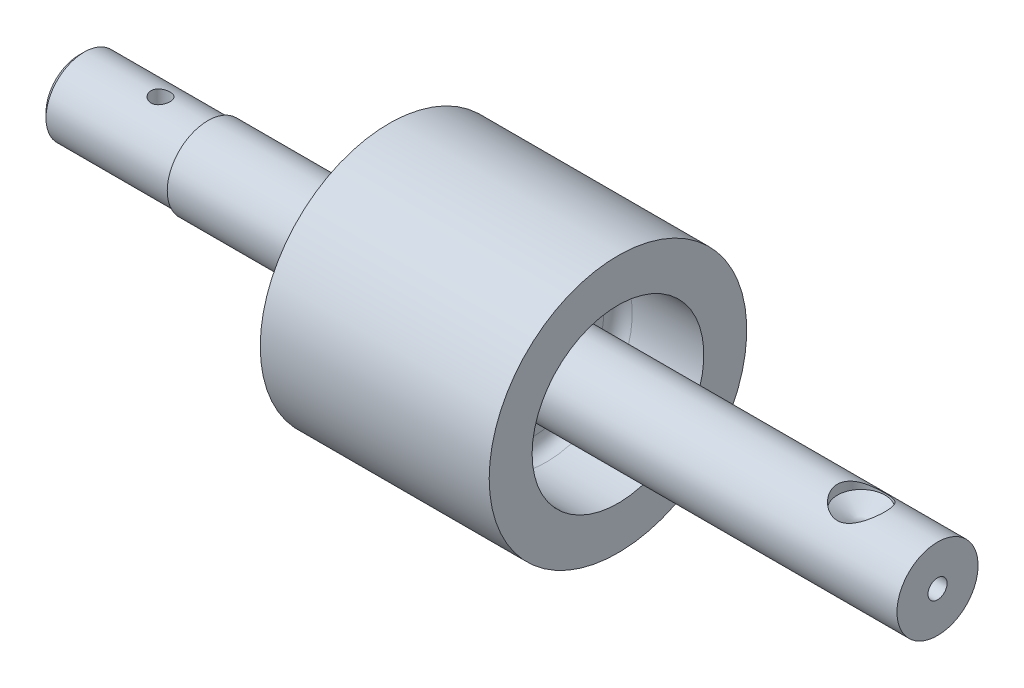
ISO-10303-21;
HEADER;
FILE_DESCRIPTION(('STEP AP214'),'2;1');
FILE_NAME('part.step','',(''),(''),'','','');
FILE_SCHEMA(('AUTOMOTIVE_DESIGN { 1 0 10303 214 1 1 1 1 }'));
ENDSEC;
DATA;
#1=APPLICATION_CONTEXT('core data for automotive mechanical design processes');
#2=APPLICATION_PROTOCOL_DEFINITION('international standard','automotive_design',2000,#1);
#3=PRODUCT_CONTEXT('',#1,'mechanical');
#4=PRODUCT('Part','Part','',(#3));
#5=PRODUCT_RELATED_PRODUCT_CATEGORY('part','',(#4));
#6=PRODUCT_DEFINITION_FORMATION('','',#4);
#7=PRODUCT_DEFINITION_CONTEXT('part definition',#1,'design');
#8=PRODUCT_DEFINITION('design','',#6,#7);
#9=PRODUCT_DEFINITION_SHAPE('','',#8);
#10=(LENGTH_UNIT() NAMED_UNIT(*) SI_UNIT(.MILLI.,.METRE.));
#11=(NAMED_UNIT(*) PLANE_ANGLE_UNIT() SI_UNIT($,.RADIAN.));
#12=(NAMED_UNIT(*) SI_UNIT($,.STERADIAN.) SOLID_ANGLE_UNIT());
#13=UNCERTAINTY_MEASURE_WITH_UNIT(LENGTH_MEASURE(1.E-05),#10,'distance_accuracy_value','');
#14=(GEOMETRIC_REPRESENTATION_CONTEXT(3) GLOBAL_UNCERTAINTY_ASSIGNED_CONTEXT((#13)) GLOBAL_UNIT_ASSIGNED_CONTEXT((#10,
#11,#12)) REPRESENTATION_CONTEXT('',''));
#15=CARTESIAN_POINT('',(0.,0.,0.));
#16=DIRECTION('',(0.,0.,1.));
#17=DIRECTION('',(1.,0.,0.));
#18=AXIS2_PLACEMENT_3D('',#15,#16,#17);
#19=CARTESIAN_POINT('',(0.,0.,0.));
#20=DIRECTION('',(-1.,0.,0.));
#21=DIRECTION('',(0.,0.,1.));
#22=AXIS2_PLACEMENT_3D('',#19,#20,#21);
#23=CYLINDRICAL_SURFACE('',#22,8.);
#24=CARTESIAN_POINT('',(17.1,7.74596669241484,1.99999999999999));
#25=CARTESIAN_POINT('',(16.9895593992587,7.74596880070288,1.99999686287445));
#26=CARTESIAN_POINT('',(16.8790840810572,7.74835444811678,1.99082099639812));
#27=CARTESIAN_POINT('',(16.6613059374612,7.75761489594051,1.95441850037103));
#28=CARTESIAN_POINT('',(16.5540049964255,7.76449230897304,1.92718136539368));
#29=CARTESIAN_POINT('',(16.3457571694503,7.7819097967692,1.85559295970563));
#30=CARTESIAN_POINT('',(16.2448022756914,7.79244514152366,1.81126378228359));
#31=CARTESIAN_POINT('',(16.0517513179681,7.81598553623007,1.7068169130091));
#32=CARTESIAN_POINT('',(15.9596556303358,7.82899069102791,1.64669855084854));
#33=CARTESIAN_POINT('',(15.7849106837902,7.856325730845,1.5109667418495));
#34=CARTESIAN_POINT('',(15.70248511972,7.87067678098427,1.43506951016324));
#35=CARTESIAN_POINT('',(15.5513908845117,7.89890300412235,1.27054565128053));
#36=CARTESIAN_POINT('',(15.4827234995026,7.91277813253111,1.18191783534424));
#37=CARTESIAN_POINT('',(15.360179625895,7.93872332416466,0.992916160863162));
#38=CARTESIAN_POINT('',(15.3065228894708,7.95076549920474,0.892395660956095));
#39=CARTESIAN_POINT('',(15.2169522846775,7.97144649540787,0.683410547434209));
#40=CARTESIAN_POINT('',(15.1810357984676,7.98008581867475,0.574947108633551));
#41=CARTESIAN_POINT('',(15.1286817323371,7.99283807078544,0.355487007003328));
#42=CARTESIAN_POINT('',(15.1118642845387,7.99703915075451,0.244586175639179));
#43=CARTESIAN_POINT('',(15.0969932965796,8.00074875285838,0.0214630554102149));
#44=CARTESIAN_POINT('',(15.0989369822323,8.00025796877363,-0.0907590356304551));
#45=CARTESIAN_POINT('',(15.1212598802001,7.99470475962828,-0.310704494344774));
#46=CARTESIAN_POINT('',(15.1412290600431,7.98974401872699,-0.418472431202134));
#47=CARTESIAN_POINT('',(15.1983770160388,7.97592669219883,-0.629076494827371));
#48=CARTESIAN_POINT('',(15.2355567083019,7.96706989918753,-0.731912358740874));
#49=CARTESIAN_POINT('',(15.3264020565497,7.94630007760717,-0.930813407003611));
#50=CARTESIAN_POINT('',(15.3802136357294,7.93436015756043,-1.02680901953301));
#51=CARTESIAN_POINT('',(15.502684543293,7.90871923047719,-1.20855124468097));
#52=CARTESIAN_POINT('',(15.5713464548485,7.89501791721992,-1.29429607017101));
#53=CARTESIAN_POINT('',(15.7237669935859,7.86690971015616,-1.45554807016991));
#54=CARTESIAN_POINT('',(15.8078839138782,7.85249375620734,-1.53071535815039));
#55=CARTESIAN_POINT('',(15.9876799788322,7.82492034813365,-1.66595275192603));
#56=CARTESIAN_POINT('',(16.0833596635928,7.81176295284777,-1.72602215209203));
#57=CARTESIAN_POINT('',(16.2842320273192,7.78816397465319,-1.82957625804519));
#58=CARTESIAN_POINT('',(16.3894685842506,7.77773586980577,-1.87297913394098));
#59=CARTESIAN_POINT('',(16.6060683744612,7.76094912111966,-1.94137124127268));
#60=CARTESIAN_POINT('',(16.7174302911865,7.75458960648175,-1.96636441310581));
#61=CARTESIAN_POINT('',(16.9399676012185,7.74684284831313,-1.99666371093214));
#62=CARTESIAN_POINT('',(17.0510702346637,7.74532871274919,-2.0024723791357));
#63=CARTESIAN_POINT('',(17.2726575492625,7.74709874784831,-1.99561359241243));
#64=CARTESIAN_POINT('',(17.383142286361,7.75038247681013,-1.98294783827903));
#65=CARTESIAN_POINT('',(17.5984914119638,7.76125665563649,-1.93994037115012));
#66=CARTESIAN_POINT('',(17.7034181812567,7.768775761875,-1.90989125462539));
#67=CARTESIAN_POINT('',(17.9067451662813,7.7872057461677,-1.83329446533649));
#68=CARTESIAN_POINT('',(18.0051446072443,7.79811702598891,-1.78674483817003));
#69=CARTESIAN_POINT('',(18.1947530222939,7.8223690967461,-1.67741653434924));
#70=CARTESIAN_POINT('',(18.2857830720345,7.83575334885313,-1.6143374030685));
#71=CARTESIAN_POINT('',(18.4561506902411,7.86333666457373,-1.47412058586891));
#72=CARTESIAN_POINT('',(18.5354863333201,7.87753586182776,-1.39698058961088));
#73=CARTESIAN_POINT('',(18.6822488340568,7.90557922425285,-1.22852544196945));
#74=CARTESIAN_POINT('',(18.749328050039,7.91940561649468,-1.13690390506318));
#75=CARTESIAN_POINT('',(18.867148693561,7.94477773290987,-0.943405365389346));
#76=CARTESIAN_POINT('',(18.9178909732866,7.95632357603169,-0.841528897915178));
#77=CARTESIAN_POINT('',(19.0011568276223,7.9757609259065,-0.631116403462179));
#78=CARTESIAN_POINT('',(19.0338114275032,7.98367864017925,-0.522634762055762));
#79=CARTESIAN_POINT('',(19.0803682676867,7.99508234716634,-0.301499520637613));
#80=CARTESIAN_POINT('',(19.0942741269912,7.99856919514738,-0.18884673008248));
#81=CARTESIAN_POINT('',(19.1027351791511,8.00068338817612,0.0341670528866463));
#82=CARTESIAN_POINT('',(19.0978034181908,7.99943957759977,0.144507653932043));
#83=CARTESIAN_POINT('',(19.0699043454113,7.99251792914887,0.3627349928295));
#84=CARTESIAN_POINT('',(19.0469375699737,7.98684022314338,0.470621803561855));
#85=CARTESIAN_POINT('',(18.9838955604583,7.97170865707778,0.680342071289546));
#86=CARTESIAN_POINT('',(18.9439130933712,7.96227529004785,0.782204989161723));
#87=CARTESIAN_POINT('',(18.8480588419609,7.94062577827316,0.977834106083245));
#88=CARTESIAN_POINT('',(18.792185054659,7.92840928277515,1.07159928253126));
#89=CARTESIAN_POINT('',(18.6645695320077,7.90214499360574,1.2508038568466));
#90=CARTESIAN_POINT('',(18.5924797141923,7.88806033883329,1.33598997659667));
#91=CARTESIAN_POINT('',(18.4351542960453,7.85981298114379,1.493230040547));
#92=CARTESIAN_POINT('',(18.3499153677777,7.84565025934604,1.56528065015318));
#93=CARTESIAN_POINT('',(18.1667971716211,7.81854951691005,1.69552405294366));
#94=CARTESIAN_POINT('',(18.0687117532695,7.80563927346578,1.75343323883275));
#95=CARTESIAN_POINT('',(17.8638890202504,7.78287910989656,1.85185379317094));
#96=CARTESIAN_POINT('',(17.7571580678123,7.77302696466428,1.8923778195043));
#97=CARTESIAN_POINT('',(17.5588459763297,7.75903817501475,1.948845057142));
#98=CARTESIAN_POINT('',(17.4682136712277,7.75417326006998,1.96798634119375));
#99=CARTESIAN_POINT('',(17.2850622620046,7.7476367716524,1.99356458514353));
#100=CARTESIAN_POINT('',(17.1925433195112,7.74596492578216,2.0000026287435));
#101=CARTESIAN_POINT('',(17.1,7.74596669241484,1.99999999999999));
#102=B_SPLINE_CURVE_WITH_KNOTS('',3,(#24,#25,#26,#27,#28,#29,#30,#31,#32,#33,#34,#35,#36,#37,
#38,#39,#40,#41,#42,#43,#44,#45,#46,#47,#48,#49,#50,#51,#52,#53,#54,#55,#56,#57,#58,#59,#60,#61,
#62,#63,#64,#65,#66,#67,#68,#69,#70,#71,#72,#73,#74,#75,#76,#77,#78,#79,#80,#81,#82,#83,#84,#85,
#86,#87,#88,#89,#90,#91,#92,#93,#94,#95,#96,#97,#98,#99,#100,#101),.UNSPECIFIED.,.T.,.F.,(4,2,2,
2,2,2,2,2,2,2,2,2,2,2,2,2,2,2,2,2,2,2,2,2,2,2,2,2,2,2,2,2,2,2,2,2,2,2,4),(0.,0.330981953388906,
0.662156593142931,0.992904581732818,1.32366661404382,1.6609916335438,1.99834817183893,
2.34041197118335,2.68242527877673,3.01751000796276,3.35254518932816,3.68014610151157,
4.00776445379828,4.33834299403554,4.66897908375129,5.00856373257528,5.3481642495984,
5.6894114560672,6.03058560103636,6.36274859809371,6.69488101747039,7.02157924007363,
7.34831617137132,7.68146276687323,8.01466415108034,8.35620264772253,8.6977233257564,
9.03673658245541,9.37568439127228,9.70546756901962,10.0352409390158,10.3632390124777,
10.6912784459045,11.0271767726565,11.363160252524,11.7054118182895,12.0474137709605,
12.3247826174462,12.6021278008237),.UNSPECIFIED.);
#103=CARTESIAN_POINT('',(17.1,7.74596669241484,1.99999999999999));
#104=VERTEX_POINT('',#103);
#105=EDGE_CURVE('E60',#104,#104,#102,.T.);
#106=ORIENTED_EDGE('',*,*,#105,.T.);
#107=EDGE_LOOP('',(#106));
#108=FACE_BOUND('',#107,.T.);
#109=CARTESIAN_POINT('',(1.08249999999999,0.,0.));
#110=DIRECTION('',(1.,0.,0.));
#111=DIRECTION('',(0.,0.,-1.));
#112=AXIS2_PLACEMENT_3D('',#109,#110,#111);
#113=CIRCLE('',#112,8.);
#114=CARTESIAN_POINT('',(1.08249999999999,0.,-8.));
#115=VERTEX_POINT('',#114);
#116=EDGE_CURVE('E93',#115,#115,#113,.T.);
#117=ORIENTED_EDGE('',*,*,#116,.T.);
#118=EDGE_LOOP('',(#117));
#119=FACE_BOUND('',#118,.T.);
#120=CARTESIAN_POINT('',(27.,0.,0.));
#121=DIRECTION('',(-1.,0.,0.));
#122=DIRECTION('',(0.,0.,1.));
#123=AXIS2_PLACEMENT_3D('',#120,#121,#122);
#124=CIRCLE('',#123,8.);
#125=CARTESIAN_POINT('',(27.,0.,8.));
#126=VERTEX_POINT('',#125);
#127=EDGE_CURVE('E114',#126,#126,#124,.T.);
#128=ORIENTED_EDGE('',*,*,#127,.T.);
#129=EDGE_LOOP('',(#128));
#130=FACE_BOUND('',#129,.T.);
#131=ADVANCED_FACE('F47',(#108,#119,#130),#23,.T.);
#132=CARTESIAN_POINT('',(27.,8.,0.));
#133=DIRECTION('',(1.,0.,0.));
#134=DIRECTION('',(0.,0.,-1.));
#135=AXIS2_PLACEMENT_3D('',#132,#133,#134);
#136=PLANE('',#135);
#137=ORIENTED_EDGE('',*,*,#127,.F.);
#138=EDGE_LOOP('',(#137));
#139=FACE_BOUND('',#138,.T.);
#140=CARTESIAN_POINT('',(27.,0.,0.));
#141=DIRECTION('',(-1.,0.,0.));
#142=DIRECTION('',(0.,0.,1.));
#143=AXIS2_PLACEMENT_3D('',#140,#141,#142);
#144=CIRCLE('',#143,8.5);
#145=CARTESIAN_POINT('',(27.,0.,8.5));
#146=VERTEX_POINT('',#145);
#147=EDGE_CURVE('E111',#146,#146,#144,.T.);
#148=ORIENTED_EDGE('',*,*,#147,.T.);
#149=EDGE_LOOP('',(#148));
#150=FACE_BOUND('',#149,.T.);
#151=ADVANCED_FACE('F204',(#139,#150),#136,.F.);
#152=CARTESIAN_POINT('',(0.,0.,0.));
#153=DIRECTION('',(-1.,0.,0.));
#154=DIRECTION('',(0.,0.,1.));
#155=AXIS2_PLACEMENT_3D('',#152,#153,#154);
#156=CYLINDRICAL_SURFACE('',#155,8.5);
#157=CARTESIAN_POINT('',(80.,0.,0.));
#158=DIRECTION('',(1.,0.,0.));
#159=DIRECTION('',(0.,0.,-1.));
#160=AXIS2_PLACEMENT_3D('',#157,#158,#159);
#161=CIRCLE('',#160,8.5);
#162=CARTESIAN_POINT('',(80.,0.,-8.5));
#163=VERTEX_POINT('',#162);
#164=EDGE_CURVE('E138',#163,#163,#161,.F.);
#165=ORIENTED_EDGE('',*,*,#164,.T.);
#166=EDGE_LOOP('',(#165));
#167=FACE_BOUND('',#166,.T.);
#168=ORIENTED_EDGE('',*,*,#147,.F.);
#169=EDGE_LOOP('',(#168));
#170=FACE_BOUND('',#169,.T.);
#171=ADVANCED_FACE('F201',(#167,#170),#156,.T.);
#172=CARTESIAN_POINT('',(83.,8.5,0.));
#173=DIRECTION('',(1.,0.,0.));
#174=DIRECTION('',(0.,0.,-1.));
#175=AXIS2_PLACEMENT_3D('',#172,#173,#174);
#176=PLANE('',#175);
#177=CARTESIAN_POINT('',(83.,0.,0.));
#178=DIRECTION('',(1.,0.,0.));
#179=DIRECTION('',(0.,0.,-1.));
#180=AXIS2_PLACEMENT_3D('',#177,#178,#179);
#181=CIRCLE('',#180,15.);
#182=CARTESIAN_POINT('',(83.,0.,-15.));
#183=VERTEX_POINT('',#182);
#184=EDGE_CURVE('E132',#183,#183,#181,.F.);
#185=ORIENTED_EDGE('',*,*,#184,.T.);
#186=EDGE_LOOP('',(#185));
#187=FACE_BOUND('',#186,.T.);
#188=CARTESIAN_POINT('',(83.,0.,0.));
#189=DIRECTION('',(1.,0.,0.));
#190=DIRECTION('',(0.,0.,-1.));
#191=AXIS2_PLACEMENT_3D('',#188,#189,#190);
#192=CIRCLE('',#191,11.5);
#193=CARTESIAN_POINT('',(83.,0.,-11.5));
#194=VERTEX_POINT('',#193);
#195=EDGE_CURVE('E129',#194,#194,#192,.T.);
#196=ORIENTED_EDGE('',*,*,#195,.T.);
#197=EDGE_LOOP('',(#196));
#198=FACE_BOUND('',#197,.T.);
#199=ADVANCED_FACE('F197',(#187,#198),#176,.F.);
#200=CARTESIAN_POINT('',(0.,0.,0.));
#201=DIRECTION('',(-1.,0.,0.));
#202=DIRECTION('',(0.,0.,1.));
#203=AXIS2_PLACEMENT_3D('',#200,#201,#202);
#204=CYLINDRICAL_SURFACE('',#203,18.);
#205=CARTESIAN_POINT('',(80.,0.,0.));
#206=DIRECTION('',(1.,0.,0.));
#207=DIRECTION('',(0.,0.,-1.));
#208=AXIS2_PLACEMENT_3D('',#205,#206,#207);
#209=CIRCLE('',#208,18.);
#210=CARTESIAN_POINT('',(80.,0.,-18.));
#211=VERTEX_POINT('',#210);
#212=EDGE_CURVE('E135',#211,#211,#209,.T.);
#213=ORIENTED_EDGE('',*,*,#212,.T.);
#214=EDGE_LOOP('',(#213));
#215=FACE_BOUND('',#214,.T.);
#216=CARTESIAN_POINT('',(65.,0.,0.));
#217=DIRECTION('',(-1.,0.,0.));
#218=DIRECTION('',(0.,0.,1.));
#219=AXIS2_PLACEMENT_3D('',#216,#217,#218);
#220=CIRCLE('',#219,18.);
#221=CARTESIAN_POINT('',(65.,0.,18.));
#222=VERTEX_POINT('',#221);
#223=EDGE_CURVE('E108',#222,#222,#220,.T.);
#224=ORIENTED_EDGE('',*,*,#223,.T.);
#225=EDGE_LOOP('',(#224));
#226=FACE_BOUND('',#225,.T.);
#227=ADVANCED_FACE('F193',(#215,#226),#204,.F.);
#228=CARTESIAN_POINT('',(65.,18.,0.));
#229=DIRECTION('',(1.,0.,0.));
#230=DIRECTION('',(0.,0.,-1.));
#231=AXIS2_PLACEMENT_3D('',#228,#229,#230);
#232=PLANE('',#231);
#233=ORIENTED_EDGE('',*,*,#223,.F.);
#234=EDGE_LOOP('',(#233));
#235=FACE_BOUND('',#234,.T.);
#236=CARTESIAN_POINT('',(65.,0.,0.));
#237=DIRECTION('',(-1.,0.,0.));
#238=DIRECTION('',(0.,0.,1.));
#239=AXIS2_PLACEMENT_3D('',#236,#237,#238);
#240=CIRCLE('',#239,27.);
#241=CARTESIAN_POINT('',(65.,0.,27.));
#242=VERTEX_POINT('',#241);
#243=EDGE_CURVE('E105',#242,#242,#240,.T.);
#244=ORIENTED_EDGE('',*,*,#243,.T.);
#245=EDGE_LOOP('',(#244));
#246=FACE_BOUND('',#245,.T.);
#247=ADVANCED_FACE('F189',(#235,#246),#232,.F.);
#248=CARTESIAN_POINT('',(0.,0.,0.));
#249=DIRECTION('',(-1.,0.,0.));
#250=DIRECTION('',(0.,0.,1.));
#251=AXIS2_PLACEMENT_3D('',#248,#249,#250);
#252=CYLINDRICAL_SURFACE('',#251,27.);
#253=ORIENTED_EDGE('',*,*,#243,.F.);
#254=EDGE_LOOP('',(#253));
#255=FACE_BOUND('',#254,.T.);
#256=CARTESIAN_POINT('',(113.,0.,0.));
#257=DIRECTION('',(-1.,0.,0.));
#258=DIRECTION('',(0.,0.,1.));
#259=AXIS2_PLACEMENT_3D('',#256,#257,#258);
#260=CIRCLE('',#259,27.);
#261=CARTESIAN_POINT('',(113.,0.,27.));
#262=VERTEX_POINT('',#261);
#263=EDGE_CURVE('E102',#262,#262,#260,.T.);
#264=ORIENTED_EDGE('',*,*,#263,.T.);
#265=EDGE_LOOP('',(#264));
#266=FACE_BOUND('',#265,.T.);
#267=ADVANCED_FACE('F185',(#255,#266),#252,.T.);
#268=CARTESIAN_POINT('',(113.,27.,0.));
#269=DIRECTION('',(-1.,0.,0.));
#270=DIRECTION('',(0.,0.,1.));
#271=AXIS2_PLACEMENT_3D('',#268,#269,#270);
#272=PLANE('',#271);
#273=ORIENTED_EDGE('',*,*,#263,.F.);
#274=EDGE_LOOP('',(#273));
#275=FACE_BOUND('',#274,.T.);
#276=CARTESIAN_POINT('',(113.,0.,0.));
#277=DIRECTION('',(-1.,0.,0.));
#278=DIRECTION('',(0.,0.,1.));
#279=AXIS2_PLACEMENT_3D('',#276,#277,#278);
#280=CIRCLE('',#279,18.);
#281=CARTESIAN_POINT('',(113.,0.,18.));
#282=VERTEX_POINT('',#281);
#283=EDGE_CURVE('E99',#282,#282,#280,.T.);
#284=ORIENTED_EDGE('',*,*,#283,.T.);
#285=EDGE_LOOP('',(#284));
#286=FACE_BOUND('',#285,.T.);
#287=ADVANCED_FACE('F181',(#275,#286),#272,.F.);
#288=CARTESIAN_POINT('',(0.,0.,0.));
#289=DIRECTION('',(-1.,0.,0.));
#290=DIRECTION('',(0.,0.,1.));
#291=AXIS2_PLACEMENT_3D('',#288,#289,#290);
#292=CYLINDRICAL_SURFACE('',#291,18.);
#293=CARTESIAN_POINT('',(98.,0.,0.));
#294=DIRECTION('',(-1.,0.,0.));
#295=DIRECTION('',(0.,0.,1.));
#296=AXIS2_PLACEMENT_3D('',#293,#294,#295);
#297=CIRCLE('',#296,18.);
#298=CARTESIAN_POINT('',(98.,0.,18.));
#299=VERTEX_POINT('',#298);
#300=EDGE_CURVE('E126',#299,#299,#297,.T.);
#301=ORIENTED_EDGE('',*,*,#300,.T.);
#302=EDGE_LOOP('',(#301));
#303=FACE_BOUND('',#302,.T.);
#304=ORIENTED_EDGE('',*,*,#283,.F.);
#305=EDGE_LOOP('',(#304));
#306=FACE_BOUND('',#305,.T.);
#307=ADVANCED_FACE('F177',(#303,#306),#292,.F.);
#308=CARTESIAN_POINT('',(95.,18.,0.));
#309=DIRECTION('',(-1.,0.,0.));
#310=DIRECTION('',(0.,0.,1.));
#311=AXIS2_PLACEMENT_3D('',#308,#309,#310);
#312=PLANE('',#311);
#313=CARTESIAN_POINT('',(95.,0.,0.));
#314=DIRECTION('',(-1.,0.,0.));
#315=DIRECTION('',(0.,0.,1.));
#316=AXIS2_PLACEMENT_3D('',#313,#314,#315);
#317=CIRCLE('',#316,11.5);
#318=CARTESIAN_POINT('',(95.,0.,11.5));
#319=VERTEX_POINT('',#318);
#320=EDGE_CURVE('E120',#319,#319,#317,.T.);
#321=ORIENTED_EDGE('',*,*,#320,.T.);
#322=EDGE_LOOP('',(#321));
#323=FACE_BOUND('',#322,.T.);
#324=CARTESIAN_POINT('',(95.,0.,0.));
#325=DIRECTION('',(-1.,0.,0.));
#326=DIRECTION('',(0.,0.,1.));
#327=AXIS2_PLACEMENT_3D('',#324,#325,#326);
#328=CIRCLE('',#327,15.);
#329=CARTESIAN_POINT('',(95.,0.,15.));
#330=VERTEX_POINT('',#329);
#331=EDGE_CURVE('E117',#330,#330,#328,.F.);
#332=ORIENTED_EDGE('',*,*,#331,.T.);
#333=EDGE_LOOP('',(#332));
#334=FACE_BOUND('',#333,.T.);
#335=ADVANCED_FACE('F173',(#323,#334),#312,.F.);
#336=CARTESIAN_POINT('',(0.,0.,0.));
#337=DIRECTION('',(-1.,0.,0.));
#338=DIRECTION('',(0.,0.,1.));
#339=AXIS2_PLACEMENT_3D('',#336,#337,#338);
#340=CYLINDRICAL_SURFACE('',#339,8.49999999999999);
#341=CARTESIAN_POINT('',(164.,6.87386354243376,4.99999999999999));
#342=CARTESIAN_POINT('',(163.873611523246,6.87386328024943,5.00000015930085));
#343=CARTESIAN_POINT('',(163.747225442999,6.87736235650568,4.99520047377));
#344=CARTESIAN_POINT('',(163.495560107949,6.89120233733464,4.97608962722064));
#345=CARTESIAN_POINT('',(163.370280841889,6.90154317223797,4.96177856305615));
#346=CARTESIAN_POINT('',(163.121757608854,6.92863932939117,4.92387022541017));
#347=CARTESIAN_POINT('',(162.998515059058,6.94539893683357,4.90026674799));
#348=CARTESIAN_POINT('',(162.754994732862,6.98466632628496,4.8441307073239));
#349=CARTESIAN_POINT('',(162.63471837446,7.00717680126676,4.81159396033929));
#350=CARTESIAN_POINT('',(162.281218728761,7.0817754370153,4.70173229633664));
#351=CARTESIAN_POINT('',(162.053315130949,7.14117199990977,4.61183990116074));
#352=CARTESIAN_POINT('',(161.6160874431,7.2725046275448,4.40181230183401));
#353=CARTESIAN_POINT('',(161.406769261023,7.34444465823708,4.28166752723489));
#354=CARTESIAN_POINT('',(160.985607802073,7.50294471793316,3.9981483123035));
#355=CARTESIAN_POINT('',(160.776334736664,7.59023048579024,3.83136056823379));
#356=CARTESIAN_POINT('',(160.386540103734,7.76380092015242,3.4661540428193));
#357=CARTESIAN_POINT('',(160.206038949396,7.85008483597422,3.26771300194426));
#358=CARTESIAN_POINT('',(159.951397298001,7.97715958201913,2.93782109475717));
#359=CARTESIAN_POINT('',(159.865840929802,8.02101011024444,2.81619934682844));
#360=CARTESIAN_POINT('',(159.705400313087,8.10486891057681,2.56488101226765));
#361=CARTESIAN_POINT('',(159.630511653279,8.14487876862596,2.4351877954015));
#362=CARTESIAN_POINT('',(159.4922144363,8.21990024218038,2.16850723485442));
#363=CARTESIAN_POINT('',(159.428801057365,8.25491395568722,2.03152298622984));
#364=CARTESIAN_POINT('',(159.314238806956,8.31890005782311,1.75115979854085));
#365=CARTESIAN_POINT('',(159.263088015568,8.34787339208278,1.60778186469034));
#366=CARTESIAN_POINT('',(159.177957570569,8.39648677786718,1.32932369461338));
#367=CARTESIAN_POINT('',(159.142827463362,8.41674214274336,1.19470218425627));
#368=CARTESIAN_POINT('',(159.083812096516,8.45093624799413,0.92223563002605));
#369=CARTESIAN_POINT('',(159.05992522946,8.46487589130039,0.784391049906548));
#370=CARTESIAN_POINT('',(159.023779981102,8.48602091008405,0.506770313310894));
#371=CARTESIAN_POINT('',(159.011513440398,8.49323101076744,0.366995582193777));
#372=CARTESIAN_POINT('',(158.998785183643,8.50071301588826,0.0867294668849142));
#373=CARTESIAN_POINT('',(158.998322334744,8.50098558614838,-0.0537618472390174));
#374=CARTESIAN_POINT('',(159.008551499848,8.49497185330104,-0.317330291338025));
#375=CARTESIAN_POINT('',(159.017915329218,8.48946649455453,-0.440479544625992));
#376=CARTESIAN_POINT('',(159.045672007075,8.47320713383874,-0.685443799972576));
#377=CARTESIAN_POINT('',(159.064067604581,8.46245153384776,-0.807258384247204));
#378=CARTESIAN_POINT('',(159.1096580834,8.43594090027986,-1.04863308658365));
#379=CARTESIAN_POINT('',(159.136849968077,8.42018756931813,-1.16819395776076));
#380=CARTESIAN_POINT('',(159.199716199807,8.38403670418657,-1.40436247324706));
#381=CARTESIAN_POINT('',(159.235393830669,8.36363737224027,-1.52096895489056));
#382=CARTESIAN_POINT('',(159.355158235981,8.29579078285027,-1.86684916696266));
#383=CARTESIAN_POINT('',(159.451690727962,8.24186605153133,-2.09069284158802));
#384=CARTESIAN_POINT('',(159.674250025254,8.12116934942211,-2.51919572283859));
#385=CARTESIAN_POINT('',(159.800284926716,8.05439385297776,-2.72384964171564));
#386=CARTESIAN_POINT('',(160.094978140113,7.90450835902858,-3.13396607957368));
#387=CARTESIAN_POINT('',(160.266896697046,7.82040139106944,-3.33672671742592));
#388=CARTESIAN_POINT('',(160.639960925357,7.64933256221481,-3.71219743465307));
#389=CARTESIAN_POINT('',(160.841144526972,7.56236711144526,-3.88486786599593));
#390=CARTESIAN_POINT('',(161.293415415446,7.38430308124499,-4.21435506221366));
#391=CARTESIAN_POINT('',(161.547552575389,7.29378878786022,-4.36738665051726));
#392=CARTESIAN_POINT('',(161.949198136991,7.17213498113506,-4.56249844177514));
#393=CARTESIAN_POINT('',(162.08645227308,7.13394390551349,-4.62178663547856));
#394=CARTESIAN_POINT('',(162.367156736835,7.06383370336596,-4.72824603696914));
#395=CARTESIAN_POINT('',(162.510604714783,7.03191222344626,-4.77542179340564));
#396=CARTESIAN_POINT('',(162.767515485974,6.98263217470012,-4.84708756455658));
#397=CARTESIAN_POINT('',(162.879909289272,6.96361723991322,-4.87430483647615));
#398=CARTESIAN_POINT('',(163.107029029303,6.93071316261644,-4.92097885878481));
#399=CARTESIAN_POINT('',(163.22175447045,6.91682294263231,-4.94043724055462));
#400=CARTESIAN_POINT('',(163.452718021785,6.89465862744962,-4.9713222821669));
#401=CARTESIAN_POINT('',(163.568954693927,6.88637954198308,-4.9827560790043));
#402=CARTESIAN_POINT('',(163.802219760647,6.87572137218644,-4.99745325914951));
#403=CARTESIAN_POINT('',(163.919248173534,6.87334242476786,-5.00071645286012));
#404=CARTESIAN_POINT('',(164.153310830086,6.87457613768645,-4.99902030367866));
#405=CARTESIAN_POINT('',(164.270344997841,6.87819377679412,-4.99405412821045));
#406=CARTESIAN_POINT('',(164.503486984628,6.89129481001975,-4.97596011785057));
#407=CARTESIAN_POINT('',(164.619594448644,6.90078035222467,-4.96282929408413));
#408=CARTESIAN_POINT('',(164.850066386438,6.92527848499908,-4.92858602573232));
#409=CARTESIAN_POINT('',(164.964430364263,6.94029261876835,-4.90747135256502));
#410=CARTESIAN_POINT('',(165.190698564213,6.97533099940525,-4.85753859710188));
#411=CARTESIAN_POINT('',(165.302601768993,6.99535727757618,-4.82871739120645));
#412=CARTESIAN_POINT('',(165.634662811115,7.06222982788807,-4.7308776029679));
#413=CARTESIAN_POINT('',(165.850276280794,7.11576680562986,-4.65061879596498));
#414=CARTESIAN_POINT('',(166.265632629386,7.23486753805701,-4.46306838065695));
#415=CARTESIAN_POINT('',(166.465369281432,7.30043597843589,-4.35576623413027));
#416=CARTESIAN_POINT('',(166.880396218853,7.45002972375644,-4.09552588794573));
#417=CARTESIAN_POINT('',(167.092304789297,7.53527804555431,-3.93788949775162));
#418=CARTESIAN_POINT('',(167.488850851091,7.7064938166272,-3.59127980725431));
#419=CARTESIAN_POINT('',(167.673463309576,7.79246185054386,-3.40227807520748));
#420=CARTESIAN_POINT('',(167.937109890475,7.92111554594081,-3.08561346071553));
#421=CARTESIAN_POINT('',(168.026810256244,7.96617516265647,-2.96763932807723));
#422=CARTESIAN_POINT('',(168.195869584863,8.05295289653605,-2.72336552554301));
#423=CARTESIAN_POINT('',(168.275232514698,8.09467229312535,-2.59706907751632));
#424=CARTESIAN_POINT('',(168.422841167288,8.17359392583098,-2.33684561863999));
#425=CARTESIAN_POINT('',(168.491090237667,8.2107975212968,-2.20292092197535));
#426=CARTESIAN_POINT('',(168.615683487596,8.27960355580661,-1.92826199818187));
#427=CARTESIAN_POINT('',(168.672029312751,8.31120676899829,-1.78752871564128));
#428=CARTESIAN_POINT('',(168.768169642509,8.36564383200788,-1.51137716536274));
#429=CARTESIAN_POINT('',(168.808903573123,8.38896507583989,-1.37638207665776));
#430=CARTESIAN_POINT('',(168.878969234829,8.4293249544813,-1.10255327126258));
#431=CARTESIAN_POINT('',(168.908302675197,8.44636453108148,-0.963720133357063));
#432=CARTESIAN_POINT('',(168.955094596685,8.47364154982319,-0.683518247595004));
#433=CARTESIAN_POINT('',(168.972562564388,8.48388442585436,-0.542151618336397));
#434=CARTESIAN_POINT('',(168.995364713171,8.49726907475098,-0.258114456663142));
#435=CARTESIAN_POINT('',(169.000700300344,8.50041167050923,-0.115444077272182));
#436=CARTESIAN_POINT('',(168.999250155438,8.49955915190382,0.151711666153929));
#437=CARTESIAN_POINT('',(168.993914640995,8.49641799542274,0.276210636074787));
#438=CARTESIAN_POINT('',(168.973997036516,8.48472634795077,0.524249725536952));
#439=CARTESIAN_POINT('',(168.959412134843,8.47617421212816,0.647789541951119));
#440=CARTESIAN_POINT('',(168.921183319464,8.4538631928862,0.892935441832934));
#441=CARTESIAN_POINT('',(168.897542804635,8.44010626302497,1.01454223301589));
#442=CARTESIAN_POINT('',(168.841494959856,8.40770833072028,1.25507082668053));
#443=CARTESIAN_POINT('',(168.809084243176,8.38906544158624,1.37399157264854));
#444=CARTESIAN_POINT('',(168.699843179686,8.32675827472577,1.72354346720334));
#445=CARTESIAN_POINT('',(168.610634854614,8.27649334490715,1.94927426707876));
#446=CARTESIAN_POINT('',(168.402410954054,8.16233248806089,2.38258507092628));
#447=CARTESIAN_POINT('',(168.283388161108,8.09843326101244,2.59016066346487));
#448=CARTESIAN_POINT('',(168.004243974062,7.95412679141928,3.00589419452436));
#449=CARTESIAN_POINT('',(167.84104797988,7.87267785241148,3.21162278361954));
#450=CARTESIAN_POINT('',(167.485409596461,7.70541511889957,3.59447885458522));
#451=CARTESIAN_POINT('',(167.292933201736,7.61959632747639,3.77157258085366));
#452=CARTESIAN_POINT('',(166.972665676869,7.48837711431364,4.02300871504688));
#453=CARTESIAN_POINT('',(166.853736124162,7.44182713913464,4.10824607586052));
#454=CARTESIAN_POINT('',(166.608139768325,7.35114714818961,4.26838282431033));
#455=CARTESIAN_POINT('',(166.4814710287,7.30701774338282,4.34327960912492));
#456=CARTESIAN_POINT('',(166.221064400918,7.22273929025571,4.48203401348326));
#457=CARTESIAN_POINT('',(166.087330931649,7.1825877979647,4.54589842931554));
#458=CARTESIAN_POINT('',(165.813466050242,7.10783616584626,4.66191254477196));
#459=CARTESIAN_POINT('',(165.673339301559,7.0732320601887,4.71407062403108));
#460=CARTESIAN_POINT('',(165.408566185527,7.01568986995248,4.79920141503266));
#461=CARTESIAN_POINT('',(165.284673656583,6.99178455606209,4.83386750958773));
#462=CARTESIAN_POINT('',(165.033668796053,6.95004859884572,4.89368553759408));
#463=CARTESIAN_POINT('',(164.906558416579,6.93221436307826,4.91884309850919));
#464=CARTESIAN_POINT('',(164.650144793703,6.90336747699233,4.95924756415398));
#465=CARTESIAN_POINT('',(164.520844149154,6.8923472543291,4.97450547120414));
#466=CARTESIAN_POINT('',(164.261028127386,6.87759552946449,4.99488145796046));
#467=CARTESIAN_POINT('',(164.130512785961,6.87386381317369,4.99999983550082));
#468=CARTESIAN_POINT('',(164.,6.87386354243376,4.99999999999999));
#469=B_SPLINE_CURVE_WITH_KNOTS('',3,(#341,#342,#343,#344,#345,#346,#347,#348,#349,#350,#351,
#352,#353,#354,#355,#356,#357,#358,#359,#360,#361,#362,#363,#364,#365,#366,#367,#368,#369,#370,
#371,#372,#373,#374,#375,#376,#377,#378,#379,#380,#381,#382,#383,#384,#385,#386,#387,#388,#389,
#390,#391,#392,#393,#394,#395,#396,#397,#398,#399,#400,#401,#402,#403,#404,#405,#406,#407,#408,
#409,#410,#411,#412,#413,#414,#415,#416,#417,#418,#419,#420,#421,#422,#423,#424,#425,#426,#427,
#428,#429,#430,#431,#432,#433,#434,#435,#436,#437,#438,#439,#440,#441,#442,#443,#444,#445,#446,
#447,#448,#449,#450,#451,#452,#453,#454,#455,#456,#457,#458,#459,#460,#461,#462,#463,#464,#465,
#466,#467,#468),.UNSPECIFIED.,.T.,.F.,(4,2,2,2,2,2,2,2,2,2,2,2,2,2,2,2,2,2,2,2,2,2,2,2,2,2,2,2,
2,2,2,2,2,2,2,2,2,2,2,2,2,2,2,2,2,2,2,2,2,2,2,2,2,2,2,2,2,2,2,2,2,2,2,4),(0.,0.379023130930053,
0.758042402340468,1.13731515051584,1.51676582825069,2.26959953515572,3.02267170357122,
3.86385803221545,4.7056385371781,5.17020411707734,5.63457702945608,6.09875436293505,
6.5628589740828,6.98404701309261,7.40517481763662,7.82600670073974,8.24679819476208,
8.61723697668294,8.98778857983437,9.35821407965802,9.72878316040325,10.4744507020791,
11.2203231127513,12.0533830266785,12.8875324469222,13.8126919043135,14.2750562496388,
14.7372467059648,15.0884778022241,15.439635009802,15.7904795041207,16.1413321396397,
16.4924762226093,16.8437489264399,17.1951197556942,17.5466332184631,18.2523650352763,
18.9583722873213,19.7877574539103,20.6178985815582,21.0820898377401,21.546102432647,
22.00997500194,22.473783399456,22.9019345351584,23.3300214533659,23.7577657069539,
24.1854603842275,24.5589622506382,24.9325777088844,25.3060530738663,25.6796728676623,
26.4199474758792,27.160401462492,27.9820049746161,28.8045700647009,29.2647382352875,
29.725022024239,30.1850212447301,30.6446901306756,31.0367616816204,31.4286008269855,
31.8200037390958,32.2113951541341),.UNSPECIFIED.);
#470=CARTESIAN_POINT('',(164.,6.87386354243376,4.99999999999999));
#471=VERTEX_POINT('',#470);
#472=EDGE_CURVE('E11',#471,#471,#469,.T.);
#473=ORIENTED_EDGE('',*,*,#472,.T.);
#474=EDGE_LOOP('',(#473));
#475=FACE_BOUND('',#474,.T.);
#476=CARTESIAN_POINT('',(98.,0.,0.));
#477=DIRECTION('',(-1.,0.,0.));
#478=DIRECTION('',(0.,0.,1.));
#479=AXIS2_PLACEMENT_3D('',#476,#477,#478);
#480=CIRCLE('',#479,8.49999999999999);
#481=CARTESIAN_POINT('',(98.,0.,8.49999999999999));
#482=VERTEX_POINT('',#481);
#483=EDGE_CURVE('E123',#482,#482,#480,.F.);
#484=ORIENTED_EDGE('',*,*,#483,.T.);
#485=EDGE_LOOP('',(#484));
#486=FACE_BOUND('',#485,.T.);
#487=CARTESIAN_POINT('',(180.,0.,0.));
#488=DIRECTION('',(-1.,0.,0.));
#489=DIRECTION('',(0.,0.,1.));
#490=AXIS2_PLACEMENT_3D('',#487,#488,#489);
#491=CIRCLE('',#490,8.49999999999999);
#492=CARTESIAN_POINT('',(180.,0.,8.49999999999999));
#493=VERTEX_POINT('',#492);
#494=EDGE_CURVE('E96',#493,#493,#491,.T.);
#495=ORIENTED_EDGE('',*,*,#494,.T.);
#496=EDGE_LOOP('',(#495));
#497=FACE_BOUND('',#496,.T.);
#498=ADVANCED_FACE('F168',(#475,#486,#497),#340,.T.);
#499=CARTESIAN_POINT('',(180.,8.49999999999999,0.));
#500=DIRECTION('',(-1.,0.,0.));
#501=DIRECTION('',(0.,0.,1.));
#502=AXIS2_PLACEMENT_3D('',#499,#500,#501);
#503=PLANE('',#502);
#504=CARTESIAN_POINT('',(180.,0.,0.));
#505=DIRECTION('',(1.,0.,0.));
#506=DIRECTION('',(0.,0.,-1.));
#507=AXIS2_PLACEMENT_3D('',#504,#505,#506);
#508=CIRCLE('',#507,1.99999999999999);
#509=CARTESIAN_POINT('',(180.,0.,-1.99999999999999));
#510=VERTEX_POINT('',#509);
#511=EDGE_CURVE('E79',#510,#510,#508,.T.);
#512=ORIENTED_EDGE('',*,*,#511,.F.);
#513=EDGE_LOOP('',(#512));
#514=FACE_BOUND('',#513,.T.);
#515=ORIENTED_EDGE('',*,*,#494,.F.);
#516=EDGE_LOOP('',(#515));
#517=FACE_BOUND('',#516,.T.);
#518=ADVANCED_FACE('F165',(#514,#517),#503,.F.);
#519=CARTESIAN_POINT('',(98.,0.,0.));
#520=DIRECTION('',(-1.,0.,0.));
#521=DIRECTION('',(0.,0.,1.));
#522=AXIS2_PLACEMENT_3D('',#519,#520,#521);
#523=TOROIDAL_SURFACE('',#522,11.5,3.);
#524=ORIENTED_EDGE('',*,*,#483,.F.);
#525=EDGE_LOOP('',(#524));
#526=FACE_BOUND('',#525,.T.);
#527=ORIENTED_EDGE('',*,*,#320,.F.);
#528=EDGE_LOOP('',(#527));
#529=FACE_BOUND('',#528,.T.);
#530=ADVANCED_FACE('F167',(#526,#529),#523,.F.);
#531=CARTESIAN_POINT('',(98.,0.,0.));
#532=DIRECTION('',(-1.,0.,0.));
#533=DIRECTION('',(0.,0.,1.));
#534=AXIS2_PLACEMENT_3D('',#531,#532,#533);
#535=TOROIDAL_SURFACE('',#534,15.,3.);
#536=ORIENTED_EDGE('',*,*,#331,.F.);
#537=EDGE_LOOP('',(#536));
#538=FACE_BOUND('',#537,.T.);
#539=ORIENTED_EDGE('',*,*,#300,.F.);
#540=EDGE_LOOP('',(#539));
#541=FACE_BOUND('',#540,.T.);
#542=ADVANCED_FACE('F233',(#538,#541),#535,.F.);
#543=CARTESIAN_POINT('',(80.,0.,0.));
#544=DIRECTION('',(1.,0.,0.));
#545=DIRECTION('',(0.,0.,-1.));
#546=AXIS2_PLACEMENT_3D('',#543,#544,#545);
#547=TOROIDAL_SURFACE('',#546,15.,3.);
#548=ORIENTED_EDGE('',*,*,#212,.F.);
#549=EDGE_LOOP('',(#548));
#550=FACE_BOUND('',#549,.T.);
#551=ORIENTED_EDGE('',*,*,#184,.F.);
#552=EDGE_LOOP('',(#551));
#553=FACE_BOUND('',#552,.T.);
#554=ADVANCED_FACE('F236',(#550,#553),#547,.F.);
#555=CARTESIAN_POINT('',(80.,0.,0.));
#556=DIRECTION('',(1.,0.,0.));
#557=DIRECTION('',(0.,0.,-1.));
#558=AXIS2_PLACEMENT_3D('',#555,#556,#557);
#559=TOROIDAL_SURFACE('',#558,11.5,3.);
#560=ORIENTED_EDGE('',*,*,#195,.F.);
#561=EDGE_LOOP('',(#560));
#562=FACE_BOUND('',#561,.T.);
#563=ORIENTED_EDGE('',*,*,#164,.F.);
#564=EDGE_LOOP('',(#563));
#565=FACE_BOUND('',#564,.T.);
#566=ADVANCED_FACE('F49',(#562,#565),#559,.F.);
#567=CARTESIAN_POINT('',(0.,0.,0.));
#568=DIRECTION('',(1.,0.,0.));
#569=DIRECTION('',(0.,0.,-1.));
#570=AXIS2_PLACEMENT_3D('',#567,#568,#569);
#571=CONICAL_SURFACE('',#570,6.9175,0.785398163397454);
#572=ORIENTED_EDGE('',*,*,#116,.F.);
#573=EDGE_LOOP('',(#572));
#574=FACE_BOUND('',#573,.T.);
#575=CARTESIAN_POINT('',(0.,0.,0.));
#576=DIRECTION('',(1.,0.,0.));
#577=DIRECTION('',(0.,0.,-1.));
#578=AXIS2_PLACEMENT_3D('',#575,#576,#577);
#579=CIRCLE('',#578,6.9175);
#580=CARTESIAN_POINT('',(0.,0.,-6.9175));
#581=VERTEX_POINT('',#580);
#582=EDGE_CURVE('E90',#581,#581,#579,.T.);
#583=ORIENTED_EDGE('',*,*,#582,.T.);
#584=EDGE_LOOP('',(#583));
#585=FACE_BOUND('',#584,.T.);
#586=ADVANCED_FACE('F161',(#574,#585),#571,.T.);
#587=CARTESIAN_POINT('',(0.,0.,0.));
#588=DIRECTION('',(1.,0.,0.));
#589=DIRECTION('',(0.,0.,-1.));
#590=AXIS2_PLACEMENT_3D('',#587,#588,#589);
#591=PLANE('',#590);
#592=ORIENTED_EDGE('',*,*,#582,.F.);
#593=EDGE_LOOP('',(#592));
#594=FACE_BOUND('',#593,.T.);
#595=ADVANCED_FACE('F155',(#594),#591,.F.);
#596=CARTESIAN_POINT('',(17.1,8.,0.));
#597=DIRECTION('',(0.,1.,0.));
#598=DIRECTION('',(0.,0.,1.));
#599=AXIS2_PLACEMENT_3D('',#596,#597,#598);
#600=CYLINDRICAL_SURFACE('',#599,1.99999999999999);
#601=CARTESIAN_POINT('',(17.1,0.,0.));
#602=DIRECTION('',(0.,1.,0.));
#603=DIRECTION('',(0.,0.,1.));
#604=AXIS2_PLACEMENT_3D('',#601,#602,#603);
#605=CIRCLE('',#604,2.);
#606=CARTESIAN_POINT('',(17.1,0.,2.));
#607=VERTEX_POINT('',#606);
#608=EDGE_CURVE('E87',#607,#607,#605,.T.);
#609=ORIENTED_EDGE('',*,*,#608,.F.);
#610=EDGE_LOOP('',(#609));
#611=FACE_BOUND('',#610,.T.);
#612=ORIENTED_EDGE('',*,*,#105,.F.);
#613=EDGE_LOOP('',(#612));
#614=FACE_BOUND('',#613,.T.);
#615=ADVANCED_FACE('F149',(#611,#614),#600,.F.);
#616=CARTESIAN_POINT('',(17.1,0.,0.));
#617=DIRECTION('',(0.,1.,0.));
#618=DIRECTION('',(0.,0.,1.));
#619=AXIS2_PLACEMENT_3D('',#616,#617,#618);
#620=CONICAL_SURFACE('',#619,2.,1.02974425867665);
#621=CARTESIAN_POINT('',(17.1,-1.20172123805512,0.));
#622=VERTEX_POINT('',#621);
#623=VERTEX_LOOP('',#622);
#624=FACE_BOUND('',#623,.T.);
#625=ORIENTED_EDGE('',*,*,#608,.T.);
#626=EDGE_LOOP('',(#625));
#627=FACE_BOUND('',#626,.T.);
#628=ADVANCED_FACE('F154',(#624,#627),#620,.F.);
#629=CARTESIAN_POINT('',(173.,0.,0.));
#630=DIRECTION('',(1.,0.,0.));
#631=DIRECTION('',(0.,0.,-1.));
#632=AXIS2_PLACEMENT_3D('',#629,#630,#631);
#633=CONICAL_SURFACE('',#632,2.,1.02974425867665);
#634=CARTESIAN_POINT('',(171.798278761945,0.,0.));
#635=VERTEX_POINT('',#634);
#636=VERTEX_LOOP('',#635);
#637=FACE_BOUND('',#636,.T.);
#638=CARTESIAN_POINT('',(173.,0.,0.));
#639=DIRECTION('',(1.,0.,0.));
#640=DIRECTION('',(0.,0.,-1.));
#641=AXIS2_PLACEMENT_3D('',#638,#639,#640);
#642=CIRCLE('',#641,2.);
#643=CARTESIAN_POINT('',(173.,0.,-2.));
#644=VERTEX_POINT('',#643);
#645=EDGE_CURVE('E82',#644,#644,#642,.T.);
#646=ORIENTED_EDGE('',*,*,#645,.T.);
#647=EDGE_LOOP('',(#646));
#648=FACE_BOUND('',#647,.T.);
#649=ADVANCED_FACE('F157',(#637,#648),#633,.F.);
#650=CARTESIAN_POINT('',(180.,0.,0.));
#651=DIRECTION('',(1.,0.,0.));
#652=DIRECTION('',(0.,0.,-1.));
#653=AXIS2_PLACEMENT_3D('',#650,#651,#652);
#654=CYLINDRICAL_SURFACE('',#653,1.99999999999999);
#655=ORIENTED_EDGE('',*,*,#645,.F.);
#656=EDGE_LOOP('',(#655));
#657=FACE_BOUND('',#656,.T.);
#658=ORIENTED_EDGE('',*,*,#511,.T.);
#659=EDGE_LOOP('',(#658));
#660=FACE_BOUND('',#659,.T.);
#661=ADVANCED_FACE('F300',(#657,#660),#654,.F.);
#662=CARTESIAN_POINT('',(164.,8.49999999999999,0.));
#663=DIRECTION('',(0.,1.,0.));
#664=DIRECTION('',(0.,0.,1.));
#665=AXIS2_PLACEMENT_3D('',#662,#663,#664);
#666=CYLINDRICAL_SURFACE('',#665,4.99999999999999);
#667=CARTESIAN_POINT('',(164.,6.5043030951378,0.));
#668=DIRECTION('',(0.,1.,0.));
#669=DIRECTION('',(0.,0.,1.));
#670=AXIS2_PLACEMENT_3D('',#667,#668,#669);
#671=CIRCLE('',#670,5.);
#672=CARTESIAN_POINT('',(164.,6.5043030951378,5.));
#673=VERTEX_POINT('',#672);
#674=EDGE_CURVE('E77',#673,#673,#671,.T.);
#675=ORIENTED_EDGE('',*,*,#674,.F.);
#676=EDGE_LOOP('',(#675));
#677=FACE_BOUND('',#676,.T.);
#678=ORIENTED_EDGE('',*,*,#472,.F.);
#679=EDGE_LOOP('',(#678));
#680=FACE_BOUND('',#679,.T.);
#681=ADVANCED_FACE('F73',(#677,#680),#666,.F.);
#682=CARTESIAN_POINT('',(164.,6.5043030951378,0.));
#683=DIRECTION('',(0.,1.,0.));
#684=DIRECTION('',(0.,0.,1.));
#685=AXIS2_PLACEMENT_3D('',#682,#683,#684);
#686=CONICAL_SURFACE('',#685,5.,1.02974425867665);
#687=CARTESIAN_POINT('',(164.,3.5,0.));
#688=VERTEX_POINT('',#687);
#689=VERTEX_LOOP('',#688);
#690=FACE_BOUND('',#689,.T.);
#691=ORIENTED_EDGE('',*,*,#674,.T.);
#692=EDGE_LOOP('',(#691));
#693=FACE_BOUND('',#692,.T.);
#694=ADVANCED_FACE('F70',(#690,#693),#686,.F.);
#695=CLOSED_SHELL('',(#131,#151,#171,#199,#227,#247,#267,#287,#307,#335,#498,#518,#530,#542,
#554,#566,#586,#595,#615,#628,#649,#661,#681,#694));
#696=MANIFOLD_SOLID_BREP('B2',#695);
#697=ADVANCED_BREP_SHAPE_REPRESENTATION('',(#18,#696),#14);
#698=SHAPE_DEFINITION_REPRESENTATION(#9,#697);
ENDSEC;
END-ISO-10303-21;
